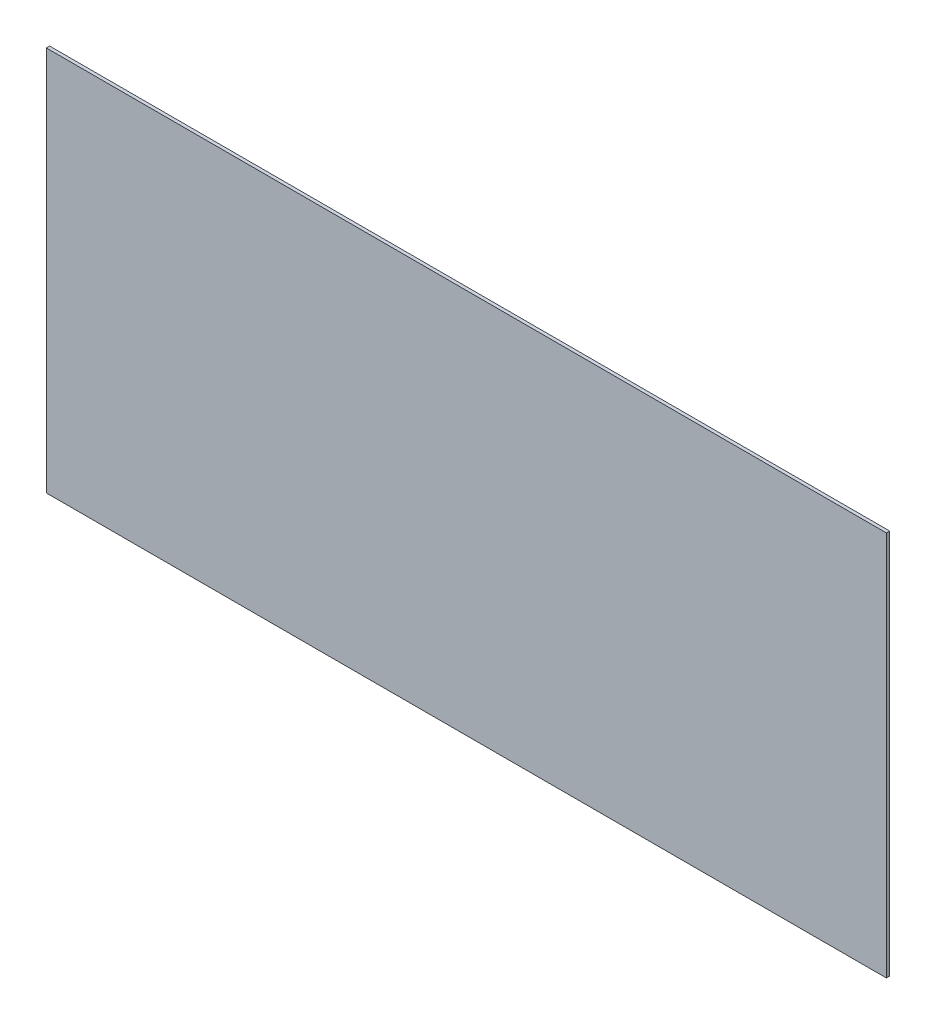
ISO-10303-21;
HEADER;
FILE_DESCRIPTION(('STEP AP214'),'2;1');
FILE_NAME('part.step','',(''),(''),'','','');
FILE_SCHEMA(('AUTOMOTIVE_DESIGN { 1 0 10303 214 1 1 1 1 }'));
ENDSEC;
DATA;
#1=APPLICATION_CONTEXT('core data for automotive mechanical design processes');
#2=APPLICATION_PROTOCOL_DEFINITION('international standard','automotive_design',2000,#1);
#3=PRODUCT_CONTEXT('',#1,'mechanical');
#4=PRODUCT('Part','Part','',(#3));
#5=PRODUCT_RELATED_PRODUCT_CATEGORY('part','',(#4));
#6=PRODUCT_DEFINITION_FORMATION('','',#4);
#7=PRODUCT_DEFINITION_CONTEXT('part definition',#1,'design');
#8=PRODUCT_DEFINITION('design','',#6,#7);
#9=PRODUCT_DEFINITION_SHAPE('','',#8);
#10=(LENGTH_UNIT() NAMED_UNIT(*) SI_UNIT(.MILLI.,.METRE.));
#11=(NAMED_UNIT(*) PLANE_ANGLE_UNIT() SI_UNIT($,.RADIAN.));
#12=(NAMED_UNIT(*) SI_UNIT($,.STERADIAN.) SOLID_ANGLE_UNIT());
#13=UNCERTAINTY_MEASURE_WITH_UNIT(LENGTH_MEASURE(1.E-05),#10,'distance_accuracy_value','');
#14=(GEOMETRIC_REPRESENTATION_CONTEXT(3) GLOBAL_UNCERTAINTY_ASSIGNED_CONTEXT((#13)) GLOBAL_UNIT_ASSIGNED_CONTEXT((#10,
#11,#12)) REPRESENTATION_CONTEXT('',''));
#15=CARTESIAN_POINT('',(0.,0.,0.));
#16=DIRECTION('',(0.,0.,1.));
#17=DIRECTION('',(1.,0.,0.));
#18=AXIS2_PLACEMENT_3D('',#15,#16,#17);
#19=CARTESIAN_POINT('',(661.607818449282,901.696034700859,4.));
#20=DIRECTION('',(1.,0.,0.));
#21=DIRECTION('',(0.,0.,-1.));
#22=AXIS2_PLACEMENT_3D('',#19,#20,#21);
#23=PLANE('',#22);
#24=DIRECTION('',(0.,-1.,0.));
#25=VECTOR('',#24,1.);
#26=CARTESIAN_POINT('',(661.607818449282,901.696034700859,0.));
#27=LINE('',#26,#25);
#28=CARTESIAN_POINT('',(661.607818449282,901.696034700859,0.));
#29=VERTEX_POINT('',#28);
#30=CARTESIAN_POINT('',(661.607818449282,433.696034700859,0.));
#31=VERTEX_POINT('',#30);
#32=EDGE_CURVE('E98',#29,#31,#27,.T.);
#33=ORIENTED_EDGE('',*,*,#32,.T.);
#34=DIRECTION('',(0.,0.,-1.));
#35=VECTOR('',#34,1.);
#36=CARTESIAN_POINT('',(661.607818449282,433.696034700859,4.));
#37=LINE('',#36,#35);
#38=CARTESIAN_POINT('',(661.607818449282,433.696034700859,4.));
#39=VERTEX_POINT('',#38);
#40=EDGE_CURVE('E11',#39,#31,#37,.T.);
#41=ORIENTED_EDGE('',*,*,#40,.F.);
#42=DIRECTION('',(0.,-1.,0.));
#43=VECTOR('',#42,1.);
#44=CARTESIAN_POINT('',(661.607818449282,901.696034700859,4.));
#45=LINE('',#44,#43);
#46=CARTESIAN_POINT('',(661.607818449282,901.696034700859,4.));
#47=VERTEX_POINT('',#46);
#48=EDGE_CURVE('E86',#47,#39,#45,.T.);
#49=ORIENTED_EDGE('',*,*,#48,.F.);
#50=DIRECTION('',(0.,0.,-1.));
#51=VECTOR('',#50,1.);
#52=CARTESIAN_POINT('',(661.607818449282,901.696034700859,4.));
#53=LINE('',#52,#51);
#54=EDGE_CURVE('E94',#47,#29,#53,.T.);
#55=ORIENTED_EDGE('',*,*,#54,.T.);
#56=EDGE_LOOP('',(#33,#41,#49,#55));
#57=FACE_BOUND('',#56,.T.);
#58=ADVANCED_FACE('F35',(#57),#23,.F.);
#59=CARTESIAN_POINT('',(661.607818449282,433.696034700859,4.));
#60=DIRECTION('',(0.,1.,0.));
#61=DIRECTION('',(0.,0.,1.));
#62=AXIS2_PLACEMENT_3D('',#59,#60,#61);
#63=PLANE('',#62);
#64=DIRECTION('',(1.,0.,0.));
#65=VECTOR('',#64,1.);
#66=CARTESIAN_POINT('',(661.607818449282,433.696034700859,0.));
#67=LINE('',#66,#65);
#68=CARTESIAN_POINT('',(1681.60781844928,433.696034700859,0.));
#69=VERTEX_POINT('',#68);
#70=EDGE_CURVE('E90',#31,#69,#67,.T.);
#71=ORIENTED_EDGE('',*,*,#70,.T.);
#72=DIRECTION('',(0.,0.,-1.));
#73=VECTOR('',#72,1.);
#74=CARTESIAN_POINT('',(1681.60781844928,433.696034700859,4.));
#75=LINE('',#74,#73);
#76=CARTESIAN_POINT('',(1681.60781844928,433.696034700859,4.));
#77=VERTEX_POINT('',#76);
#78=EDGE_CURVE('E43',#77,#69,#75,.T.);
#79=ORIENTED_EDGE('',*,*,#78,.F.);
#80=DIRECTION('',(1.,0.,0.));
#81=VECTOR('',#80,1.);
#82=CARTESIAN_POINT('',(661.607818449282,433.696034700859,4.));
#83=LINE('',#82,#81);
#84=EDGE_CURVE('E81',#39,#77,#83,.T.);
#85=ORIENTED_EDGE('',*,*,#84,.F.);
#86=ORIENTED_EDGE('',*,*,#40,.T.);
#87=EDGE_LOOP('',(#71,#79,#85,#86));
#88=FACE_BOUND('',#87,.T.);
#89=ADVANCED_FACE('F89',(#88),#63,.F.);
#90=CARTESIAN_POINT('',(1681.60781844928,433.696034700859,4.));
#91=DIRECTION('',(-1.,0.,0.));
#92=DIRECTION('',(0.,0.,1.));
#93=AXIS2_PLACEMENT_3D('',#90,#91,#92);
#94=PLANE('',#93);
#95=DIRECTION('',(0.,1.,0.));
#96=VECTOR('',#95,1.);
#97=CARTESIAN_POINT('',(1681.60781844928,433.696034700859,0.));
#98=LINE('',#97,#96);
#99=CARTESIAN_POINT('',(1681.60781844928,901.696034700859,0.));
#100=VERTEX_POINT('',#99);
#101=EDGE_CURVE('E68',#69,#100,#98,.T.);
#102=ORIENTED_EDGE('',*,*,#101,.T.);
#103=DIRECTION('',(0.,0.,-1.));
#104=VECTOR('',#103,1.);
#105=CARTESIAN_POINT('',(1681.60781844928,901.696034700859,4.));
#106=LINE('',#105,#104);
#107=CARTESIAN_POINT('',(1681.60781844928,901.696034700859,4.));
#108=VERTEX_POINT('',#107);
#109=EDGE_CURVE('E91',#108,#100,#106,.T.);
#110=ORIENTED_EDGE('',*,*,#109,.F.);
#111=DIRECTION('',(0.,1.,0.));
#112=VECTOR('',#111,1.);
#113=CARTESIAN_POINT('',(1681.60781844928,433.696034700859,4.));
#114=LINE('',#113,#112);
#115=EDGE_CURVE('E84',#77,#108,#114,.T.);
#116=ORIENTED_EDGE('',*,*,#115,.F.);
#117=ORIENTED_EDGE('',*,*,#78,.T.);
#118=EDGE_LOOP('',(#102,#110,#116,#117));
#119=FACE_BOUND('',#118,.T.);
#120=ADVANCED_FACE('F92',(#119),#94,.F.);
#121=CARTESIAN_POINT('',(661.607818449282,901.696034700859,4.));
#122=DIRECTION('',(0.,-1.,0.));
#123=DIRECTION('',(0.,0.,-1.));
#124=AXIS2_PLACEMENT_3D('',#121,#122,#123);
#125=PLANE('',#124);
#126=DIRECTION('',(-1.,0.,0.));
#127=VECTOR('',#126,1.);
#128=CARTESIAN_POINT('',(661.607818449282,901.696034700859,0.));
#129=LINE('',#128,#127);
#130=EDGE_CURVE('E74',#100,#29,#129,.T.);
#131=ORIENTED_EDGE('',*,*,#130,.T.);
#132=ORIENTED_EDGE('',*,*,#54,.F.);
#133=DIRECTION('',(-1.,0.,0.));
#134=VECTOR('',#133,1.);
#135=CARTESIAN_POINT('',(661.607818449282,901.696034700859,4.));
#136=LINE('',#135,#134);
#137=EDGE_CURVE('E51',#108,#47,#136,.T.);
#138=ORIENTED_EDGE('',*,*,#137,.F.);
#139=ORIENTED_EDGE('',*,*,#109,.T.);
#140=EDGE_LOOP('',(#131,#132,#138,#139));
#141=FACE_BOUND('',#140,.T.);
#142=ADVANCED_FACE('F105',(#141),#125,.F.);
#143=CARTESIAN_POINT('',(0.,0.,4.));
#144=DIRECTION('',(0.,0.,1.));
#145=DIRECTION('',(1.,0.,0.));
#146=AXIS2_PLACEMENT_3D('',#143,#144,#145);
#147=PLANE('',#146);
#148=ORIENTED_EDGE('',*,*,#48,.T.);
#149=ORIENTED_EDGE('',*,*,#84,.T.);
#150=ORIENTED_EDGE('',*,*,#115,.T.);
#151=ORIENTED_EDGE('',*,*,#137,.T.);
#152=EDGE_LOOP('',(#148,#149,#150,#151));
#153=FACE_BOUND('',#152,.T.);
#154=ADVANCED_FACE('F82',(#153),#147,.T.);
#155=CARTESIAN_POINT('',(0.,0.,0.));
#156=DIRECTION('',(0.,0.,1.));
#157=DIRECTION('',(1.,0.,0.));
#158=AXIS2_PLACEMENT_3D('',#155,#156,#157);
#159=PLANE('',#158);
#160=ORIENTED_EDGE('',*,*,#32,.F.);
#161=ORIENTED_EDGE('',*,*,#130,.F.);
#162=ORIENTED_EDGE('',*,*,#101,.F.);
#163=ORIENTED_EDGE('',*,*,#70,.F.);
#164=EDGE_LOOP('',(#160,#161,#162,#163));
#165=FACE_BOUND('',#164,.T.);
#166=ADVANCED_FACE('F108',(#165),#159,.F.);
#167=CLOSED_SHELL('',(#58,#89,#120,#142,#154,#166));
#168=MANIFOLD_SOLID_BREP('B2',#167);
#169=ADVANCED_BREP_SHAPE_REPRESENTATION('',(#18,#168),#14);
#170=SHAPE_DEFINITION_REPRESENTATION(#9,#169);
ENDSEC;
END-ISO-10303-21;
